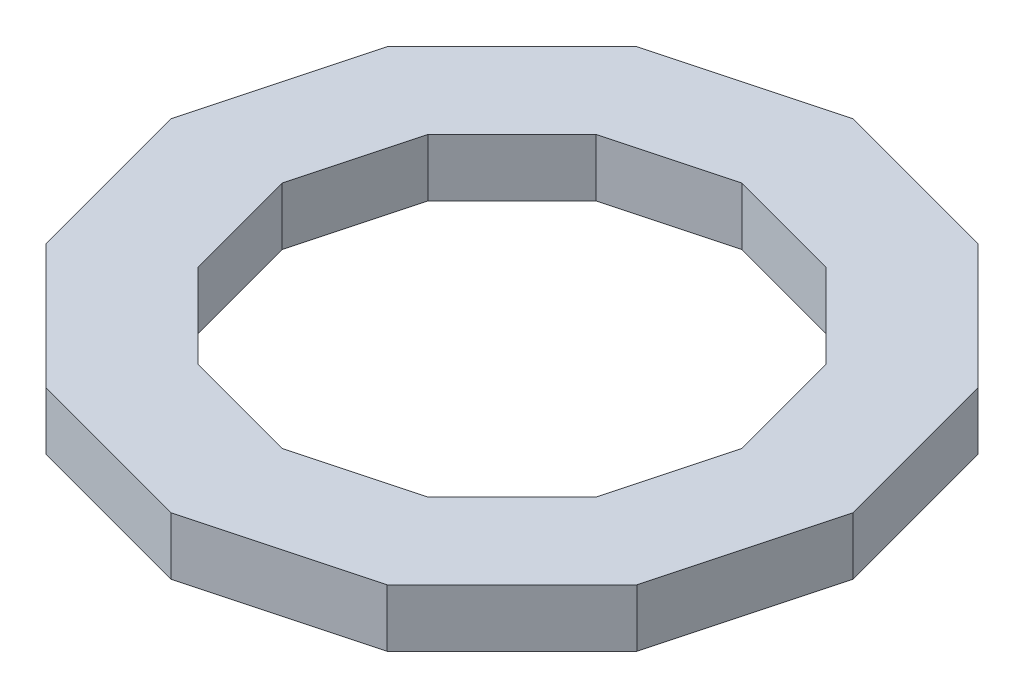
ISO-10303-21;
HEADER;
FILE_DESCRIPTION(('STEP AP214'),'2;1');
FILE_NAME('part.step','',(''),(''),'','','');
FILE_SCHEMA(('AUTOMOTIVE_DESIGN { 1 0 10303 214 1 1 1 1 }'));
ENDSEC;
DATA;
#1=APPLICATION_CONTEXT('core data for automotive mechanical design processes');
#2=APPLICATION_PROTOCOL_DEFINITION('international standard','automotive_design',2000,#1);
#3=PRODUCT_CONTEXT('',#1,'mechanical');
#4=PRODUCT('Part','Part','',(#3));
#5=PRODUCT_RELATED_PRODUCT_CATEGORY('part','',(#4));
#6=PRODUCT_DEFINITION_FORMATION('','',#4);
#7=PRODUCT_DEFINITION_CONTEXT('part definition',#1,'design');
#8=PRODUCT_DEFINITION('design','',#6,#7);
#9=PRODUCT_DEFINITION_SHAPE('','',#8);
#10=(LENGTH_UNIT() NAMED_UNIT(*) SI_UNIT(.MILLI.,.METRE.));
#11=(NAMED_UNIT(*) PLANE_ANGLE_UNIT() SI_UNIT($,.RADIAN.));
#12=(NAMED_UNIT(*) SI_UNIT($,.STERADIAN.) SOLID_ANGLE_UNIT());
#13=UNCERTAINTY_MEASURE_WITH_UNIT(LENGTH_MEASURE(1.E-05),#10,'distance_accuracy_value','');
#14=(GEOMETRIC_REPRESENTATION_CONTEXT(3) GLOBAL_UNCERTAINTY_ASSIGNED_CONTEXT((#13)) GLOBAL_UNIT_ASSIGNED_CONTEXT((#10,
#11,#12)) REPRESENTATION_CONTEXT('',''));
#15=CARTESIAN_POINT('',(0.,0.,0.));
#16=DIRECTION('',(0.,0.,1.));
#17=DIRECTION('',(1.,0.,0.));
#18=AXIS2_PLACEMENT_3D('',#15,#16,#17);
#19=CARTESIAN_POINT('',(0.,19.05,0.));
#20=DIRECTION('',(0.,1.,0.));
#21=DIRECTION('',(0.,0.,1.));
#22=AXIS2_PLACEMENT_3D('',#19,#20,#21);
#23=PLANE('',#22);
#24=DIRECTION('',(0.258819045102521,0.,-0.965925826289068));
#25=VECTOR('',#24,1.);
#26=CARTESIAN_POINT('',(97.7385649287255,19.05,56.4293867718074));
#27=LINE('',#26,#25);
#28=CARTESIAN_POINT('',(97.7385649287255,19.05,56.4293867718074));
#29=VERTEX_POINT('',#28);
#30=CARTESIAN_POINT('',(112.858773543615,19.05,0.));
#31=VERTEX_POINT('',#30);
#32=EDGE_CURVE('E292',#29,#31,#27,.T.);
#33=ORIENTED_EDGE('',*,*,#32,.T.);
#34=DIRECTION('',(-0.258819045102521,0.,-0.965925826289068));
#35=VECTOR('',#34,1.);
#36=CARTESIAN_POINT('',(112.858773543615,19.05,0.));
#37=LINE('',#36,#35);
#38=CARTESIAN_POINT('',(97.7385649287255,19.05,-56.4293867718074));
#39=VERTEX_POINT('',#38);
#40=EDGE_CURVE('E296',#31,#39,#37,.T.);
#41=ORIENTED_EDGE('',*,*,#40,.T.);
#42=DIRECTION('',(-0.707106781186548,0.,-0.707106781186547));
#43=VECTOR('',#42,1.);
#44=CARTESIAN_POINT('',(97.7385649287255,19.05,-56.4293867718074));
#45=LINE('',#44,#43);
#46=CARTESIAN_POINT('',(56.4293867718072,19.05,-97.7385649287256));
#47=VERTEX_POINT('',#46);
#48=EDGE_CURVE('E299',#39,#47,#45,.T.);
#49=ORIENTED_EDGE('',*,*,#48,.T.);
#50=DIRECTION('',(-0.965925826289068,0.,-0.258819045102521));
#51=VECTOR('',#50,1.);
#52=CARTESIAN_POINT('',(56.4293867718072,19.05,-97.7385649287256));
#53=LINE('',#52,#51);
#54=CARTESIAN_POINT('',(0.,19.05,-112.858773543615));
#55=VERTEX_POINT('',#54);
#56=EDGE_CURVE('E301',#47,#55,#53,.T.);
#57=ORIENTED_EDGE('',*,*,#56,.T.);
#58=DIRECTION('',(-0.965925826289068,0.,0.258819045102521));
#59=VECTOR('',#58,1.);
#60=CARTESIAN_POINT('',(0.,19.05,-112.858773543615));
#61=LINE('',#60,#59);
#62=CARTESIAN_POINT('',(-56.4293867718074,19.05,-97.7385649287256));
#63=VERTEX_POINT('',#62);
#64=EDGE_CURVE('E303',#55,#63,#61,.T.);
#65=ORIENTED_EDGE('',*,*,#64,.T.);
#66=DIRECTION('',(-0.707106781186547,0.,0.707106781186547));
#67=VECTOR('',#66,1.);
#68=CARTESIAN_POINT('',(-56.4293867718074,19.05,-97.7385649287256));
#69=LINE('',#68,#67);
#70=CARTESIAN_POINT('',(-97.7385649287256,19.05,-56.4293867718075));
#71=VERTEX_POINT('',#70);
#72=EDGE_CURVE('E305',#63,#71,#69,.T.);
#73=ORIENTED_EDGE('',*,*,#72,.T.);
#74=DIRECTION('',(-0.258819045102521,0.,0.965925826289068));
#75=VECTOR('',#74,1.);
#76=CARTESIAN_POINT('',(-97.7385649287256,19.05,-56.4293867718075));
#77=LINE('',#76,#75);
#78=CARTESIAN_POINT('',(-112.858773543615,19.05,0.));
#79=VERTEX_POINT('',#78);
#80=EDGE_CURVE('E307',#71,#79,#77,.T.);
#81=ORIENTED_EDGE('',*,*,#80,.T.);
#82=DIRECTION('',(0.258819045102521,0.,0.965925826289068));
#83=VECTOR('',#82,1.);
#84=CARTESIAN_POINT('',(-112.858773543615,19.05,0.));
#85=LINE('',#84,#83);
#86=CARTESIAN_POINT('',(-97.7385649287256,19.05,56.4293867718074));
#87=VERTEX_POINT('',#86);
#88=EDGE_CURVE('E310',#79,#87,#85,.T.);
#89=ORIENTED_EDGE('',*,*,#88,.T.);
#90=DIRECTION('',(0.707106781186548,0.,0.707106781186548));
#91=VECTOR('',#90,1.);
#92=CARTESIAN_POINT('',(-97.7385649287256,19.05,56.4293867718074));
#93=LINE('',#92,#91);
#94=CARTESIAN_POINT('',(-56.4293867718074,19.05,97.7385649287255));
#95=VERTEX_POINT('',#94);
#96=EDGE_CURVE('E312',#87,#95,#93,.T.);
#97=ORIENTED_EDGE('',*,*,#96,.T.);
#98=DIRECTION('',(0.965925826289068,0.,0.258819045102521));
#99=VECTOR('',#98,1.);
#100=CARTESIAN_POINT('',(-56.4293867718074,19.05,97.7385649287255));
#101=LINE('',#100,#99);
#102=CARTESIAN_POINT('',(0.,19.05,112.858773543615));
#103=VERTEX_POINT('',#102);
#104=EDGE_CURVE('E314',#95,#103,#101,.T.);
#105=ORIENTED_EDGE('',*,*,#104,.T.);
#106=DIRECTION('',(0.965925826289068,0.,-0.258819045102521));
#107=VECTOR('',#106,1.);
#108=CARTESIAN_POINT('',(0.,19.05,112.858773543615));
#109=LINE('',#108,#107);
#110=CARTESIAN_POINT('',(56.4293867718074,19.05,97.7385649287255));
#111=VERTEX_POINT('',#110);
#112=EDGE_CURVE('E316',#103,#111,#109,.T.);
#113=ORIENTED_EDGE('',*,*,#112,.T.);
#114=DIRECTION('',(0.707106781186548,0.,-0.707106781186548));
#115=VECTOR('',#114,1.);
#116=CARTESIAN_POINT('',(56.4293867718074,19.05,97.7385649287255));
#117=LINE('',#116,#115);
#118=EDGE_CURVE('E318',#111,#29,#117,.T.);
#119=ORIENTED_EDGE('',*,*,#118,.T.);
#120=EDGE_LOOP('',(#33,#41,#49,#57,#65,#73,#81,#89,#97,#105,#113,#119));
#121=FACE_BOUND('',#120,.T.);
#122=DIRECTION('',(-0.258819045102521,0.,-0.965925826289068));
#123=VECTOR('',#122,1.);
#124=CARTESIAN_POINT('',(76.0443525682322,19.05,0.));
#125=LINE('',#124,#123);
#126=CARTESIAN_POINT('',(76.0443525682322,19.05,0.));
#127=VERTEX_POINT('',#126);
#128=CARTESIAN_POINT('',(65.8563411384295,19.05,-38.0221762841161));
#129=VERTEX_POINT('',#128);
#130=EDGE_CURVE('E204',#127,#129,#125,.T.);
#131=ORIENTED_EDGE('',*,*,#130,.F.);
#132=DIRECTION('',(0.25881904510252,0.,-0.965925826289068));
#133=VECTOR('',#132,1.);
#134=CARTESIAN_POINT('',(65.8563411384295,19.05,38.0221762841161));
#135=LINE('',#134,#133);
#136=CARTESIAN_POINT('',(65.8563411384295,19.05,38.0221762841161));
#137=VERTEX_POINT('',#136);
#138=EDGE_CURVE('E196',#137,#127,#135,.T.);
#139=ORIENTED_EDGE('',*,*,#138,.F.);
#140=DIRECTION('',(0.707106781186547,0.,-0.707106781186548));
#141=VECTOR('',#140,1.);
#142=CARTESIAN_POINT('',(38.0221762841161,19.05,65.8563411384295));
#143=LINE('',#142,#141);
#144=CARTESIAN_POINT('',(38.0221762841161,19.05,65.8563411384295));
#145=VERTEX_POINT('',#144);
#146=EDGE_CURVE('E239',#145,#137,#143,.T.);
#147=ORIENTED_EDGE('',*,*,#146,.F.);
#148=DIRECTION('',(0.965925826289068,0.,-0.258819045102521));
#149=VECTOR('',#148,1.);
#150=CARTESIAN_POINT('',(0.,19.05,76.0443525682322));
#151=LINE('',#150,#149);
#152=CARTESIAN_POINT('',(0.,19.05,76.0443525682322));
#153=VERTEX_POINT('',#152);
#154=EDGE_CURVE('E236',#153,#145,#151,.T.);
#155=ORIENTED_EDGE('',*,*,#154,.F.);
#156=DIRECTION('',(0.965925826289068,0.,0.258819045102521));
#157=VECTOR('',#156,1.);
#158=CARTESIAN_POINT('',(-38.0221762841161,19.05,65.8563411384296));
#159=LINE('',#158,#157);
#160=CARTESIAN_POINT('',(-38.0221762841161,19.05,65.8563411384296));
#161=VERTEX_POINT('',#160);
#162=EDGE_CURVE('E234',#161,#153,#159,.T.);
#163=ORIENTED_EDGE('',*,*,#162,.F.);
#164=DIRECTION('',(0.707106781186548,0.,0.707106781186547));
#165=VECTOR('',#164,1.);
#166=CARTESIAN_POINT('',(-65.8563411384295,19.05,38.0221762841161));
#167=LINE('',#166,#165);
#168=CARTESIAN_POINT('',(-65.8563411384295,19.05,38.0221762841161));
#169=VERTEX_POINT('',#168);
#170=EDGE_CURVE('E231',#169,#161,#167,.T.);
#171=ORIENTED_EDGE('',*,*,#170,.F.);
#172=DIRECTION('',(0.258819045102521,0.,0.965925826289068));
#173=VECTOR('',#172,1.);
#174=CARTESIAN_POINT('',(-76.0443525682322,19.05,0.));
#175=LINE('',#174,#173);
#176=CARTESIAN_POINT('',(-76.0443525682322,19.05,0.));
#177=VERTEX_POINT('',#176);
#178=EDGE_CURVE('E229',#177,#169,#175,.T.);
#179=ORIENTED_EDGE('',*,*,#178,.F.);
#180=DIRECTION('',(-0.25881904510252,0.,0.965925826289069));
#181=VECTOR('',#180,1.);
#182=CARTESIAN_POINT('',(-65.8563411384296,19.05,-38.0221762841161));
#183=LINE('',#182,#181);
#184=CARTESIAN_POINT('',(-65.8563411384296,19.05,-38.0221762841161));
#185=VERTEX_POINT('',#184);
#186=EDGE_CURVE('E227',#185,#177,#183,.T.);
#187=ORIENTED_EDGE('',*,*,#186,.F.);
#188=DIRECTION('',(-0.707106781186547,0.,0.707106781186548));
#189=VECTOR('',#188,1.);
#190=CARTESIAN_POINT('',(-38.0221762841161,19.05,-65.8563411384296));
#191=LINE('',#190,#189);
#192=CARTESIAN_POINT('',(-38.0221762841161,19.05,-65.8563411384296));
#193=VERTEX_POINT('',#192);
#194=EDGE_CURVE('E225',#193,#185,#191,.T.);
#195=ORIENTED_EDGE('',*,*,#194,.F.);
#196=DIRECTION('',(-0.965925826289068,0.,0.258819045102521));
#197=VECTOR('',#196,1.);
#198=CARTESIAN_POINT('',(0.,19.05,-76.0443525682322));
#199=LINE('',#198,#197);
#200=CARTESIAN_POINT('',(0.,19.05,-76.0443525682322));
#201=VERTEX_POINT('',#200);
#202=EDGE_CURVE('E223',#201,#193,#199,.T.);
#203=ORIENTED_EDGE('',*,*,#202,.F.);
#204=DIRECTION('',(-0.965925826289069,0.,-0.25881904510252));
#205=VECTOR('',#204,1.);
#206=CARTESIAN_POINT('',(38.022176284116,19.05,-65.8563411384296));
#207=LINE('',#206,#205);
#208=CARTESIAN_POINT('',(38.022176284116,19.05,-65.8563411384296));
#209=VERTEX_POINT('',#208);
#210=EDGE_CURVE('E219',#209,#201,#207,.T.);
#211=ORIENTED_EDGE('',*,*,#210,.F.);
#212=DIRECTION('',(-0.707106781186548,0.,-0.707106781186547));
#213=VECTOR('',#212,1.);
#214=CARTESIAN_POINT('',(65.8563411384295,19.05,-38.0221762841161));
#215=LINE('',#214,#213);
#216=EDGE_CURVE('E217',#129,#209,#215,.T.);
#217=ORIENTED_EDGE('',*,*,#216,.F.);
#218=EDGE_LOOP('',(#131,#139,#147,#155,#163,#171,#179,#187,#195,#203,#211,#217));
#219=FACE_BOUND('',#218,.T.);
#220=ADVANCED_FACE('F35',(#121,#219),#23,.T.);
#221=CARTESIAN_POINT('',(0.,0.,0.));
#222=DIRECTION('',(0.,1.,0.));
#223=DIRECTION('',(0.,0.,1.));
#224=AXIS2_PLACEMENT_3D('',#221,#222,#223);
#225=PLANE('',#224);
#226=DIRECTION('',(0.258819045102521,0.,-0.965925826289068));
#227=VECTOR('',#226,1.);
#228=CARTESIAN_POINT('',(97.7385649287255,0.,56.4293867718074));
#229=LINE('',#228,#227);
#230=CARTESIAN_POINT('',(97.7385649287255,0.,56.4293867718074));
#231=VERTEX_POINT('',#230);
#232=CARTESIAN_POINT('',(112.858773543615,0.,0.));
#233=VERTEX_POINT('',#232);
#234=EDGE_CURVE('E212',#231,#233,#229,.T.);
#235=ORIENTED_EDGE('',*,*,#234,.F.);
#236=DIRECTION('',(0.707106781186548,0.,-0.707106781186548));
#237=VECTOR('',#236,1.);
#238=CARTESIAN_POINT('',(56.4293867718074,0.,97.7385649287255));
#239=LINE('',#238,#237);
#240=CARTESIAN_POINT('',(56.4293867718074,0.,97.7385649287255));
#241=VERTEX_POINT('',#240);
#242=EDGE_CURVE('E297',#241,#231,#239,.T.);
#243=ORIENTED_EDGE('',*,*,#242,.F.);
#244=DIRECTION('',(0.965925826289068,0.,-0.258819045102521));
#245=VECTOR('',#244,1.);
#246=CARTESIAN_POINT('',(0.,0.,112.858773543615));
#247=LINE('',#246,#245);
#248=CARTESIAN_POINT('',(0.,0.,112.858773543615));
#249=VERTEX_POINT('',#248);
#250=EDGE_CURVE('E341',#249,#241,#247,.T.);
#251=ORIENTED_EDGE('',*,*,#250,.F.);
#252=DIRECTION('',(0.965925826289068,0.,0.258819045102521));
#253=VECTOR('',#252,1.);
#254=CARTESIAN_POINT('',(-56.4293867718074,0.,97.7385649287255));
#255=LINE('',#254,#253);
#256=CARTESIAN_POINT('',(-56.4293867718074,0.,97.7385649287255));
#257=VERTEX_POINT('',#256);
#258=EDGE_CURVE('E339',#257,#249,#255,.T.);
#259=ORIENTED_EDGE('',*,*,#258,.F.);
#260=DIRECTION('',(0.707106781186548,0.,0.707106781186548));
#261=VECTOR('',#260,1.);
#262=CARTESIAN_POINT('',(-97.7385649287256,0.,56.4293867718074));
#263=LINE('',#262,#261);
#264=CARTESIAN_POINT('',(-97.7385649287256,0.,56.4293867718074));
#265=VERTEX_POINT('',#264);
#266=EDGE_CURVE('E337',#265,#257,#263,.T.);
#267=ORIENTED_EDGE('',*,*,#266,.F.);
#268=DIRECTION('',(0.258819045102521,0.,0.965925826289068));
#269=VECTOR('',#268,1.);
#270=CARTESIAN_POINT('',(-112.858773543615,0.,0.));
#271=LINE('',#270,#269);
#272=CARTESIAN_POINT('',(-112.858773543615,0.,0.));
#273=VERTEX_POINT('',#272);
#274=EDGE_CURVE('E335',#273,#265,#271,.T.);
#275=ORIENTED_EDGE('',*,*,#274,.F.);
#276=DIRECTION('',(-0.258819045102521,0.,0.965925826289068));
#277=VECTOR('',#276,1.);
#278=CARTESIAN_POINT('',(-97.7385649287256,0.,-56.4293867718075));
#279=LINE('',#278,#277);
#280=CARTESIAN_POINT('',(-97.7385649287256,0.,-56.4293867718075));
#281=VERTEX_POINT('',#280);
#282=EDGE_CURVE('E333',#281,#273,#279,.T.);
#283=ORIENTED_EDGE('',*,*,#282,.F.);
#284=DIRECTION('',(-0.707106781186547,0.,0.707106781186547));
#285=VECTOR('',#284,1.);
#286=CARTESIAN_POINT('',(-56.4293867718074,0.,-97.7385649287256));
#287=LINE('',#286,#285);
#288=CARTESIAN_POINT('',(-56.4293867718074,0.,-97.7385649287256));
#289=VERTEX_POINT('',#288);
#290=EDGE_CURVE('E331',#289,#281,#287,.T.);
#291=ORIENTED_EDGE('',*,*,#290,.F.);
#292=DIRECTION('',(-0.965925826289068,0.,0.258819045102521));
#293=VECTOR('',#292,1.);
#294=CARTESIAN_POINT('',(0.,0.,-112.858773543615));
#295=LINE('',#294,#293);
#296=CARTESIAN_POINT('',(0.,0.,-112.858773543615));
#297=VERTEX_POINT('',#296);
#298=EDGE_CURVE('E329',#297,#289,#295,.T.);
#299=ORIENTED_EDGE('',*,*,#298,.F.);
#300=DIRECTION('',(-0.965925826289068,0.,-0.258819045102521));
#301=VECTOR('',#300,1.);
#302=CARTESIAN_POINT('',(56.4293867718072,0.,-97.7385649287256));
#303=LINE('',#302,#301);
#304=CARTESIAN_POINT('',(56.4293867718072,0.,-97.7385649287256));
#305=VERTEX_POINT('',#304);
#306=EDGE_CURVE('E327',#305,#297,#303,.T.);
#307=ORIENTED_EDGE('',*,*,#306,.F.);
#308=DIRECTION('',(-0.707106781186548,0.,-0.707106781186547));
#309=VECTOR('',#308,1.);
#310=CARTESIAN_POINT('',(97.7385649287255,0.,-56.4293867718074));
#311=LINE('',#310,#309);
#312=CARTESIAN_POINT('',(97.7385649287255,0.,-56.4293867718074));
#313=VERTEX_POINT('',#312);
#314=EDGE_CURVE('E325',#313,#305,#311,.T.);
#315=ORIENTED_EDGE('',*,*,#314,.F.);
#316=DIRECTION('',(-0.258819045102521,0.,-0.965925826289068));
#317=VECTOR('',#316,1.);
#318=CARTESIAN_POINT('',(112.858773543615,0.,0.));
#319=LINE('',#318,#317);
#320=EDGE_CURVE('E323',#233,#313,#319,.T.);
#321=ORIENTED_EDGE('',*,*,#320,.F.);
#322=EDGE_LOOP('',(#235,#243,#251,#259,#267,#275,#283,#291,#299,#307,#315,#321));
#323=FACE_BOUND('',#322,.T.);
#324=DIRECTION('',(0.25881904510252,0.,-0.965925826289068));
#325=VECTOR('',#324,1.);
#326=CARTESIAN_POINT('',(65.8563411384295,0.,38.0221762841161));
#327=LINE('',#326,#325);
#328=CARTESIAN_POINT('',(65.8563411384295,0.,38.0221762841161));
#329=VERTEX_POINT('',#328);
#330=CARTESIAN_POINT('',(76.0443525682322,0.,0.));
#331=VERTEX_POINT('',#330);
#332=EDGE_CURVE('E58',#329,#331,#327,.T.);
#333=ORIENTED_EDGE('',*,*,#332,.T.);
#334=DIRECTION('',(-0.258819045102521,0.,-0.965925826289068));
#335=VECTOR('',#334,1.);
#336=CARTESIAN_POINT('',(76.0443525682322,0.,0.));
#337=LINE('',#336,#335);
#338=CARTESIAN_POINT('',(65.8563411384295,0.,-38.0221762841161));
#339=VERTEX_POINT('',#338);
#340=EDGE_CURVE('E211',#331,#339,#337,.T.);
#341=ORIENTED_EDGE('',*,*,#340,.T.);
#342=DIRECTION('',(-0.707106781186548,0.,-0.707106781186547));
#343=VECTOR('',#342,1.);
#344=CARTESIAN_POINT('',(65.8563411384295,0.,-38.0221762841161));
#345=LINE('',#344,#343);
#346=CARTESIAN_POINT('',(38.022176284116,0.,-65.8563411384296));
#347=VERTEX_POINT('',#346);
#348=EDGE_CURVE('E243',#339,#347,#345,.T.);
#349=ORIENTED_EDGE('',*,*,#348,.T.);
#350=DIRECTION('',(-0.965925826289069,0.,-0.25881904510252));
#351=VECTOR('',#350,1.);
#352=CARTESIAN_POINT('',(38.022176284116,0.,-65.8563411384296));
#353=LINE('',#352,#351);
#354=CARTESIAN_POINT('',(0.,0.,-76.0443525682322));
#355=VERTEX_POINT('',#354);
#356=EDGE_CURVE('E246',#347,#355,#353,.T.);
#357=ORIENTED_EDGE('',*,*,#356,.T.);
#358=DIRECTION('',(-0.965925826289068,0.,0.258819045102521));
#359=VECTOR('',#358,1.);
#360=CARTESIAN_POINT('',(0.,0.,-76.0443525682322));
#361=LINE('',#360,#359);
#362=CARTESIAN_POINT('',(-38.0221762841161,0.,-65.8563411384296));
#363=VERTEX_POINT('',#362);
#364=EDGE_CURVE('E249',#355,#363,#361,.T.);
#365=ORIENTED_EDGE('',*,*,#364,.T.);
#366=DIRECTION('',(-0.707106781186547,0.,0.707106781186548));
#367=VECTOR('',#366,1.);
#368=CARTESIAN_POINT('',(-38.0221762841161,0.,-65.8563411384296));
#369=LINE('',#368,#367);
#370=CARTESIAN_POINT('',(-65.8563411384296,0.,-38.0221762841161));
#371=VERTEX_POINT('',#370);
#372=EDGE_CURVE('E252',#363,#371,#369,.T.);
#373=ORIENTED_EDGE('',*,*,#372,.T.);
#374=DIRECTION('',(-0.25881904510252,0.,0.965925826289069));
#375=VECTOR('',#374,1.);
#376=CARTESIAN_POINT('',(-65.8563411384296,0.,-38.0221762841161));
#377=LINE('',#376,#375);
#378=CARTESIAN_POINT('',(-76.0443525682322,0.,0.));
#379=VERTEX_POINT('',#378);
#380=EDGE_CURVE('E255',#371,#379,#377,.T.);
#381=ORIENTED_EDGE('',*,*,#380,.T.);
#382=DIRECTION('',(0.258819045102521,0.,0.965925826289068));
#383=VECTOR('',#382,1.);
#384=CARTESIAN_POINT('',(-76.0443525682322,0.,0.));
#385=LINE('',#384,#383);
#386=CARTESIAN_POINT('',(-65.8563411384295,0.,38.0221762841161));
#387=VERTEX_POINT('',#386);
#388=EDGE_CURVE('E259',#379,#387,#385,.T.);
#389=ORIENTED_EDGE('',*,*,#388,.T.);
#390=DIRECTION('',(0.707106781186548,0.,0.707106781186547));
#391=VECTOR('',#390,1.);
#392=CARTESIAN_POINT('',(-65.8563411384295,0.,38.0221762841161));
#393=LINE('',#392,#391);
#394=CARTESIAN_POINT('',(-38.0221762841161,0.,65.8563411384296));
#395=VERTEX_POINT('',#394);
#396=EDGE_CURVE('E262',#387,#395,#393,.T.);
#397=ORIENTED_EDGE('',*,*,#396,.T.);
#398=DIRECTION('',(0.965925826289068,0.,0.258819045102521));
#399=VECTOR('',#398,1.);
#400=CARTESIAN_POINT('',(-38.0221762841161,0.,65.8563411384296));
#401=LINE('',#400,#399);
#402=CARTESIAN_POINT('',(0.,0.,76.0443525682322));
#403=VERTEX_POINT('',#402);
#404=EDGE_CURVE('E265',#395,#403,#401,.T.);
#405=ORIENTED_EDGE('',*,*,#404,.T.);
#406=DIRECTION('',(0.965925826289068,0.,-0.258819045102521));
#407=VECTOR('',#406,1.);
#408=CARTESIAN_POINT('',(0.,0.,76.0443525682322));
#409=LINE('',#408,#407);
#410=CARTESIAN_POINT('',(38.0221762841161,0.,65.8563411384295));
#411=VERTEX_POINT('',#410);
#412=EDGE_CURVE('E268',#403,#411,#409,.T.);
#413=ORIENTED_EDGE('',*,*,#412,.T.);
#414=DIRECTION('',(0.707106781186547,0.,-0.707106781186548));
#415=VECTOR('',#414,1.);
#416=CARTESIAN_POINT('',(38.0221762841161,0.,65.8563411384295));
#417=LINE('',#416,#415);
#418=EDGE_CURVE('E205',#411,#329,#417,.T.);
#419=ORIENTED_EDGE('',*,*,#418,.T.);
#420=EDGE_LOOP('',(#333,#341,#349,#357,#365,#373,#381,#389,#397,#405,#413,#419));
#421=FACE_BOUND('',#420,.T.);
#422=ADVANCED_FACE('F383',(#323,#421),#225,.F.);
#423=CARTESIAN_POINT('',(97.7385649287255,19.05,56.4293867718074));
#424=DIRECTION('',(-0.965925826289068,0.,-0.258819045102521));
#425=DIRECTION('',(-0.258819045102521,0.,0.965925826289068));
#426=AXIS2_PLACEMENT_3D('',#423,#424,#425);
#427=PLANE('',#426);
#428=ORIENTED_EDGE('',*,*,#234,.T.);
#429=DIRECTION('',(0.,-1.,0.));
#430=VECTOR('',#429,1.);
#431=CARTESIAN_POINT('',(112.858773543615,19.05,0.));
#432=LINE('',#431,#430);
#433=EDGE_CURVE('E11',#31,#233,#432,.T.);
#434=ORIENTED_EDGE('',*,*,#433,.F.);
#435=ORIENTED_EDGE('',*,*,#32,.F.);
#436=DIRECTION('',(0.,-1.,0.));
#437=VECTOR('',#436,1.);
#438=CARTESIAN_POINT('',(97.7385649287255,19.05,56.4293867718074));
#439=LINE('',#438,#437);
#440=EDGE_CURVE('E320',#29,#231,#439,.T.);
#441=ORIENTED_EDGE('',*,*,#440,.T.);
#442=EDGE_LOOP('',(#428,#434,#435,#441));
#443=FACE_BOUND('',#442,.T.);
#444=ADVANCED_FACE('F37',(#443),#427,.F.);
#445=CARTESIAN_POINT('',(112.858773543615,19.05,0.));
#446=DIRECTION('',(-0.965925826289068,0.,0.258819045102521));
#447=DIRECTION('',(0.258819045102521,0.,0.965925826289068));
#448=AXIS2_PLACEMENT_3D('',#445,#446,#447);
#449=PLANE('',#448);
#450=ORIENTED_EDGE('',*,*,#320,.T.);
#451=DIRECTION('',(0.,-1.,0.));
#452=VECTOR('',#451,1.);
#453=CARTESIAN_POINT('',(97.7385649287255,19.05,-56.4293867718074));
#454=LINE('',#453,#452);
#455=EDGE_CURVE('E43',#39,#313,#454,.T.);
#456=ORIENTED_EDGE('',*,*,#455,.F.);
#457=ORIENTED_EDGE('',*,*,#40,.F.);
#458=ORIENTED_EDGE('',*,*,#433,.T.);
#459=EDGE_LOOP('',(#450,#456,#457,#458));
#460=FACE_BOUND('',#459,.T.);
#461=ADVANCED_FACE('F400',(#460),#449,.F.);
#462=CARTESIAN_POINT('',(97.7385649287255,19.05,-56.4293867718074));
#463=DIRECTION('',(-0.707106781186547,0.,0.707106781186548));
#464=DIRECTION('',(0.707106781186548,0.,0.707106781186547));
#465=AXIS2_PLACEMENT_3D('',#462,#463,#464);
#466=PLANE('',#465);
#467=ORIENTED_EDGE('',*,*,#314,.T.);
#468=DIRECTION('',(0.,-1.,0.));
#469=VECTOR('',#468,1.);
#470=CARTESIAN_POINT('',(56.4293867718072,19.05,-97.7385649287256));
#471=LINE('',#470,#469);
#472=EDGE_CURVE('E370',#47,#305,#471,.T.);
#473=ORIENTED_EDGE('',*,*,#472,.F.);
#474=ORIENTED_EDGE('',*,*,#48,.F.);
#475=ORIENTED_EDGE('',*,*,#455,.T.);
#476=EDGE_LOOP('',(#467,#473,#474,#475));
#477=FACE_BOUND('',#476,.T.);
#478=ADVANCED_FACE('F377',(#477),#466,.F.);
#479=CARTESIAN_POINT('',(56.4293867718072,19.05,-97.7385649287256));
#480=DIRECTION('',(-0.258819045102521,0.,0.965925826289068));
#481=DIRECTION('',(0.965925826289068,0.,0.258819045102521));
#482=AXIS2_PLACEMENT_3D('',#479,#480,#481);
#483=PLANE('',#482);
#484=ORIENTED_EDGE('',*,*,#306,.T.);
#485=DIRECTION('',(0.,-1.,0.));
#486=VECTOR('',#485,1.);
#487=CARTESIAN_POINT('',(0.,19.05,-112.858773543615));
#488=LINE('',#487,#486);
#489=EDGE_CURVE('E367',#55,#297,#488,.T.);
#490=ORIENTED_EDGE('',*,*,#489,.F.);
#491=ORIENTED_EDGE('',*,*,#56,.F.);
#492=ORIENTED_EDGE('',*,*,#472,.T.);
#493=EDGE_LOOP('',(#484,#490,#491,#492));
#494=FACE_BOUND('',#493,.T.);
#495=ADVANCED_FACE('F389',(#494),#483,.F.);
#496=CARTESIAN_POINT('',(0.,19.05,-112.858773543615));
#497=DIRECTION('',(0.258819045102521,0.,0.965925826289068));
#498=DIRECTION('',(0.965925826289068,0.,-0.258819045102521));
#499=AXIS2_PLACEMENT_3D('',#496,#497,#498);
#500=PLANE('',#499);
#501=ORIENTED_EDGE('',*,*,#298,.T.);
#502=DIRECTION('',(0.,-1.,0.));
#503=VECTOR('',#502,1.);
#504=CARTESIAN_POINT('',(-56.4293867718074,19.05,-97.7385649287256));
#505=LINE('',#504,#503);
#506=EDGE_CURVE('E364',#63,#289,#505,.T.);
#507=ORIENTED_EDGE('',*,*,#506,.F.);
#508=ORIENTED_EDGE('',*,*,#64,.F.);
#509=ORIENTED_EDGE('',*,*,#489,.T.);
#510=EDGE_LOOP('',(#501,#507,#508,#509));
#511=FACE_BOUND('',#510,.T.);
#512=ADVANCED_FACE('F393',(#511),#500,.F.);
#513=CARTESIAN_POINT('',(-56.4293867718074,19.05,-97.7385649287256));
#514=DIRECTION('',(0.707106781186548,0.,0.707106781186547));
#515=DIRECTION('',(0.707106781186547,0.,-0.707106781186548));
#516=AXIS2_PLACEMENT_3D('',#513,#514,#515);
#517=PLANE('',#516);
#518=ORIENTED_EDGE('',*,*,#290,.T.);
#519=DIRECTION('',(0.,-1.,0.));
#520=VECTOR('',#519,1.);
#521=CARTESIAN_POINT('',(-97.7385649287256,19.05,-56.4293867718075));
#522=LINE('',#521,#520);
#523=EDGE_CURVE('E361',#71,#281,#522,.T.);
#524=ORIENTED_EDGE('',*,*,#523,.F.);
#525=ORIENTED_EDGE('',*,*,#72,.F.);
#526=ORIENTED_EDGE('',*,*,#506,.T.);
#527=EDGE_LOOP('',(#518,#524,#525,#526));
#528=FACE_BOUND('',#527,.T.);
#529=ADVANCED_FACE('F433',(#528),#517,.F.);
#530=CARTESIAN_POINT('',(-97.7385649287256,19.05,-56.4293867718075));
#531=DIRECTION('',(0.965925826289068,0.,0.258819045102521));
#532=DIRECTION('',(0.258819045102521,0.,-0.965925826289068));
#533=AXIS2_PLACEMENT_3D('',#530,#531,#532);
#534=PLANE('',#533);
#535=ORIENTED_EDGE('',*,*,#282,.T.);
#536=DIRECTION('',(0.,-1.,0.));
#537=VECTOR('',#536,1.);
#538=CARTESIAN_POINT('',(-112.858773543615,19.05,0.));
#539=LINE('',#538,#537);
#540=EDGE_CURVE('E358',#79,#273,#539,.T.);
#541=ORIENTED_EDGE('',*,*,#540,.F.);
#542=ORIENTED_EDGE('',*,*,#80,.F.);
#543=ORIENTED_EDGE('',*,*,#523,.T.);
#544=EDGE_LOOP('',(#535,#541,#542,#543));
#545=FACE_BOUND('',#544,.T.);
#546=ADVANCED_FACE('F431',(#545),#534,.F.);
#547=CARTESIAN_POINT('',(-112.858773543615,19.05,0.));
#548=DIRECTION('',(0.965925826289068,0.,-0.258819045102521));
#549=DIRECTION('',(-0.258819045102521,0.,-0.965925826289068));
#550=AXIS2_PLACEMENT_3D('',#547,#548,#549);
#551=PLANE('',#550);
#552=ORIENTED_EDGE('',*,*,#274,.T.);
#553=DIRECTION('',(0.,-1.,0.));
#554=VECTOR('',#553,1.);
#555=CARTESIAN_POINT('',(-97.7385649287256,19.05,56.4293867718074));
#556=LINE('',#555,#554);
#557=EDGE_CURVE('E355',#87,#265,#556,.T.);
#558=ORIENTED_EDGE('',*,*,#557,.F.);
#559=ORIENTED_EDGE('',*,*,#88,.F.);
#560=ORIENTED_EDGE('',*,*,#540,.T.);
#561=EDGE_LOOP('',(#552,#558,#559,#560));
#562=FACE_BOUND('',#561,.T.);
#563=ADVANCED_FACE('F427',(#562),#551,.F.);
#564=CARTESIAN_POINT('',(-97.7385649287256,19.05,56.4293867718074));
#565=DIRECTION('',(0.707106781186548,0.,-0.707106781186548));
#566=DIRECTION('',(-0.707106781186548,0.,-0.707106781186548));
#567=AXIS2_PLACEMENT_3D('',#564,#565,#566);
#568=PLANE('',#567);
#569=ORIENTED_EDGE('',*,*,#266,.T.);
#570=DIRECTION('',(0.,-1.,0.));
#571=VECTOR('',#570,1.);
#572=CARTESIAN_POINT('',(-56.4293867718074,19.05,97.7385649287255));
#573=LINE('',#572,#571);
#574=EDGE_CURVE('E352',#95,#257,#573,.T.);
#575=ORIENTED_EDGE('',*,*,#574,.F.);
#576=ORIENTED_EDGE('',*,*,#96,.F.);
#577=ORIENTED_EDGE('',*,*,#557,.T.);
#578=EDGE_LOOP('',(#569,#575,#576,#577));
#579=FACE_BOUND('',#578,.T.);
#580=ADVANCED_FACE('F422',(#579),#568,.F.);
#581=CARTESIAN_POINT('',(-56.4293867718074,19.05,97.7385649287255));
#582=DIRECTION('',(0.258819045102521,0.,-0.965925826289068));
#583=DIRECTION('',(-0.965925826289068,0.,-0.258819045102521));
#584=AXIS2_PLACEMENT_3D('',#581,#582,#583);
#585=PLANE('',#584);
#586=ORIENTED_EDGE('',*,*,#258,.T.);
#587=DIRECTION('',(0.,-1.,0.));
#588=VECTOR('',#587,1.);
#589=CARTESIAN_POINT('',(0.,19.05,112.858773543615));
#590=LINE('',#589,#588);
#591=EDGE_CURVE('E349',#103,#249,#590,.T.);
#592=ORIENTED_EDGE('',*,*,#591,.F.);
#593=ORIENTED_EDGE('',*,*,#104,.F.);
#594=ORIENTED_EDGE('',*,*,#574,.T.);
#595=EDGE_LOOP('',(#586,#592,#593,#594));
#596=FACE_BOUND('',#595,.T.);
#597=ADVANCED_FACE('F416',(#596),#585,.F.);
#598=CARTESIAN_POINT('',(0.,19.05,112.858773543615));
#599=DIRECTION('',(-0.258819045102521,0.,-0.965925826289068));
#600=DIRECTION('',(-0.965925826289068,0.,0.258819045102521));
#601=AXIS2_PLACEMENT_3D('',#598,#599,#600);
#602=PLANE('',#601);
#603=ORIENTED_EDGE('',*,*,#250,.T.);
#604=DIRECTION('',(0.,-1.,0.));
#605=VECTOR('',#604,1.);
#606=CARTESIAN_POINT('',(56.4293867718074,19.05,97.7385649287255));
#607=LINE('',#606,#605);
#608=EDGE_CURVE('E346',#111,#241,#607,.T.);
#609=ORIENTED_EDGE('',*,*,#608,.F.);
#610=ORIENTED_EDGE('',*,*,#112,.F.);
#611=ORIENTED_EDGE('',*,*,#591,.T.);
#612=EDGE_LOOP('',(#603,#609,#610,#611));
#613=FACE_BOUND('',#612,.T.);
#614=ADVANCED_FACE('F412',(#613),#602,.F.);
#615=CARTESIAN_POINT('',(56.4293867718074,19.05,97.7385649287255));
#616=DIRECTION('',(-0.707106781186548,0.,-0.707106781186548));
#617=DIRECTION('',(-0.707106781186548,0.,0.707106781186548));
#618=AXIS2_PLACEMENT_3D('',#615,#616,#617);
#619=PLANE('',#618);
#620=ORIENTED_EDGE('',*,*,#242,.T.);
#621=ORIENTED_EDGE('',*,*,#440,.F.);
#622=ORIENTED_EDGE('',*,*,#118,.F.);
#623=ORIENTED_EDGE('',*,*,#608,.T.);
#624=EDGE_LOOP('',(#620,#621,#622,#623));
#625=FACE_BOUND('',#624,.T.);
#626=ADVANCED_FACE('F407',(#625),#619,.F.);
#627=CARTESIAN_POINT('',(65.8563411384295,19.05,38.0221762841161));
#628=DIRECTION('',(-0.965925826289068,0.,-0.258819045102521));
#629=DIRECTION('',(-0.258819045102521,0.,0.965925826289068));
#630=AXIS2_PLACEMENT_3D('',#627,#628,#629);
#631=PLANE('',#630);
#632=ORIENTED_EDGE('',*,*,#332,.F.);
#633=DIRECTION('',(0.,-1.,0.));
#634=VECTOR('',#633,1.);
#635=CARTESIAN_POINT('',(65.8563411384295,19.05,38.0221762841161));
#636=LINE('',#635,#634);
#637=EDGE_CURVE('E200',#137,#329,#636,.T.);
#638=ORIENTED_EDGE('',*,*,#637,.F.);
#639=ORIENTED_EDGE('',*,*,#138,.T.);
#640=DIRECTION('',(0.,-1.,0.));
#641=VECTOR('',#640,1.);
#642=CARTESIAN_POINT('',(76.0443525682322,19.05,0.));
#643=LINE('',#642,#641);
#644=EDGE_CURVE('E199',#127,#331,#643,.T.);
#645=ORIENTED_EDGE('',*,*,#644,.T.);
#646=EDGE_LOOP('',(#632,#638,#639,#645));
#647=FACE_BOUND('',#646,.T.);
#648=ADVANCED_FACE('F198',(#647),#631,.T.);
#649=CARTESIAN_POINT('',(76.0443525682322,19.05,0.));
#650=DIRECTION('',(-0.965925826289068,0.,0.258819045102521));
#651=DIRECTION('',(0.258819045102521,0.,0.965925826289068));
#652=AXIS2_PLACEMENT_3D('',#649,#650,#651);
#653=PLANE('',#652);
#654=ORIENTED_EDGE('',*,*,#340,.F.);
#655=ORIENTED_EDGE('',*,*,#644,.F.);
#656=ORIENTED_EDGE('',*,*,#130,.T.);
#657=DIRECTION('',(0.,-1.,0.));
#658=VECTOR('',#657,1.);
#659=CARTESIAN_POINT('',(65.8563411384295,19.05,-38.0221762841161));
#660=LINE('',#659,#658);
#661=EDGE_CURVE('E213',#129,#339,#660,.T.);
#662=ORIENTED_EDGE('',*,*,#661,.T.);
#663=EDGE_LOOP('',(#654,#655,#656,#662));
#664=FACE_BOUND('',#663,.T.);
#665=ADVANCED_FACE('F208',(#664),#653,.T.);
#666=CARTESIAN_POINT('',(65.8563411384295,19.05,-38.0221762841161));
#667=DIRECTION('',(-0.707106781186547,0.,0.707106781186548));
#668=DIRECTION('',(0.707106781186548,0.,0.707106781186547));
#669=AXIS2_PLACEMENT_3D('',#666,#667,#668);
#670=PLANE('',#669);
#671=ORIENTED_EDGE('',*,*,#348,.F.);
#672=ORIENTED_EDGE('',*,*,#661,.F.);
#673=ORIENTED_EDGE('',*,*,#216,.T.);
#674=DIRECTION('',(0.,-1.,0.));
#675=VECTOR('',#674,1.);
#676=CARTESIAN_POINT('',(38.022176284116,19.05,-65.8563411384296));
#677=LINE('',#676,#675);
#678=EDGE_CURVE('E289',#209,#347,#677,.T.);
#679=ORIENTED_EDGE('',*,*,#678,.T.);
#680=EDGE_LOOP('',(#671,#672,#673,#679));
#681=FACE_BOUND('',#680,.T.);
#682=ADVANCED_FACE('F491',(#681),#670,.T.);
#683=CARTESIAN_POINT('',(38.022176284116,19.05,-65.8563411384296));
#684=DIRECTION('',(-0.25881904510252,0.,0.965925826289068));
#685=DIRECTION('',(0.965925826289069,0.,0.25881904510252));
#686=AXIS2_PLACEMENT_3D('',#683,#684,#685);
#687=PLANE('',#686);
#688=ORIENTED_EDGE('',*,*,#356,.F.);
#689=ORIENTED_EDGE('',*,*,#678,.F.);
#690=ORIENTED_EDGE('',*,*,#210,.T.);
#691=DIRECTION('',(0.,-1.,0.));
#692=VECTOR('',#691,1.);
#693=CARTESIAN_POINT('',(0.,19.05,-76.0443525682322));
#694=LINE('',#693,#692);
#695=EDGE_CURVE('E287',#201,#355,#694,.T.);
#696=ORIENTED_EDGE('',*,*,#695,.T.);
#697=EDGE_LOOP('',(#688,#689,#690,#696));
#698=FACE_BOUND('',#697,.T.);
#699=ADVANCED_FACE('F497',(#698),#687,.T.);
#700=CARTESIAN_POINT('',(0.,19.05,-76.0443525682322));
#701=DIRECTION('',(0.258819045102521,0.,0.965925826289068));
#702=DIRECTION('',(0.965925826289068,0.,-0.258819045102521));
#703=AXIS2_PLACEMENT_3D('',#700,#701,#702);
#704=PLANE('',#703);
#705=ORIENTED_EDGE('',*,*,#364,.F.);
#706=ORIENTED_EDGE('',*,*,#695,.F.);
#707=ORIENTED_EDGE('',*,*,#202,.T.);
#708=DIRECTION('',(0.,-1.,0.));
#709=VECTOR('',#708,1.);
#710=CARTESIAN_POINT('',(-38.0221762841161,19.05,-65.8563411384296));
#711=LINE('',#710,#709);
#712=EDGE_CURVE('E285',#193,#363,#711,.T.);
#713=ORIENTED_EDGE('',*,*,#712,.T.);
#714=EDGE_LOOP('',(#705,#706,#707,#713));
#715=FACE_BOUND('',#714,.T.);
#716=ADVANCED_FACE('F505',(#715),#704,.T.);
#717=CARTESIAN_POINT('',(-38.0221762841161,19.05,-65.8563411384296));
#718=DIRECTION('',(0.707106781186548,0.,0.707106781186547));
#719=DIRECTION('',(0.707106781186547,0.,-0.707106781186548));
#720=AXIS2_PLACEMENT_3D('',#717,#718,#719);
#721=PLANE('',#720);
#722=ORIENTED_EDGE('',*,*,#372,.F.);
#723=ORIENTED_EDGE('',*,*,#712,.F.);
#724=ORIENTED_EDGE('',*,*,#194,.T.);
#725=DIRECTION('',(0.,-1.,0.));
#726=VECTOR('',#725,1.);
#727=CARTESIAN_POINT('',(-65.8563411384296,19.05,-38.0221762841161));
#728=LINE('',#727,#726);
#729=EDGE_CURVE('E283',#185,#371,#728,.T.);
#730=ORIENTED_EDGE('',*,*,#729,.T.);
#731=EDGE_LOOP('',(#722,#723,#724,#730));
#732=FACE_BOUND('',#731,.T.);
#733=ADVANCED_FACE('F513',(#732),#721,.T.);
#734=CARTESIAN_POINT('',(-65.8563411384296,19.05,-38.0221762841161));
#735=DIRECTION('',(0.965925826289068,0.,0.25881904510252));
#736=DIRECTION('',(0.25881904510252,0.,-0.965925826289068));
#737=AXIS2_PLACEMENT_3D('',#734,#735,#736);
#738=PLANE('',#737);
#739=ORIENTED_EDGE('',*,*,#380,.F.);
#740=ORIENTED_EDGE('',*,*,#729,.F.);
#741=ORIENTED_EDGE('',*,*,#186,.T.);
#742=DIRECTION('',(0.,-1.,0.));
#743=VECTOR('',#742,1.);
#744=CARTESIAN_POINT('',(-76.0443525682322,19.05,0.));
#745=LINE('',#744,#743);
#746=EDGE_CURVE('E281',#177,#379,#745,.T.);
#747=ORIENTED_EDGE('',*,*,#746,.T.);
#748=EDGE_LOOP('',(#739,#740,#741,#747));
#749=FACE_BOUND('',#748,.T.);
#750=ADVANCED_FACE('F521',(#749),#738,.T.);
#751=CARTESIAN_POINT('',(-76.0443525682322,19.05,0.));
#752=DIRECTION('',(0.965925826289068,0.,-0.258819045102521));
#753=DIRECTION('',(-0.258819045102521,0.,-0.965925826289068));
#754=AXIS2_PLACEMENT_3D('',#751,#752,#753);
#755=PLANE('',#754);
#756=ORIENTED_EDGE('',*,*,#388,.F.);
#757=ORIENTED_EDGE('',*,*,#746,.F.);
#758=ORIENTED_EDGE('',*,*,#178,.T.);
#759=DIRECTION('',(0.,-1.,0.));
#760=VECTOR('',#759,1.);
#761=CARTESIAN_POINT('',(-65.8563411384295,19.05,38.0221762841161));
#762=LINE('',#761,#760);
#763=EDGE_CURVE('E279',#169,#387,#762,.T.);
#764=ORIENTED_EDGE('',*,*,#763,.T.);
#765=EDGE_LOOP('',(#756,#757,#758,#764));
#766=FACE_BOUND('',#765,.T.);
#767=ADVANCED_FACE('F529',(#766),#755,.T.);
#768=CARTESIAN_POINT('',(-65.8563411384295,19.05,38.0221762841161));
#769=DIRECTION('',(0.707106781186547,0.,-0.707106781186548));
#770=DIRECTION('',(-0.707106781186548,0.,-0.707106781186547));
#771=AXIS2_PLACEMENT_3D('',#768,#769,#770);
#772=PLANE('',#771);
#773=ORIENTED_EDGE('',*,*,#396,.F.);
#774=ORIENTED_EDGE('',*,*,#763,.F.);
#775=ORIENTED_EDGE('',*,*,#170,.T.);
#776=DIRECTION('',(0.,-1.,0.));
#777=VECTOR('',#776,1.);
#778=CARTESIAN_POINT('',(-38.0221762841161,19.05,65.8563411384296));
#779=LINE('',#778,#777);
#780=EDGE_CURVE('E277',#161,#395,#779,.T.);
#781=ORIENTED_EDGE('',*,*,#780,.T.);
#782=EDGE_LOOP('',(#773,#774,#775,#781));
#783=FACE_BOUND('',#782,.T.);
#784=ADVANCED_FACE('F537',(#783),#772,.T.);
#785=CARTESIAN_POINT('',(-38.0221762841161,19.05,65.8563411384296));
#786=DIRECTION('',(0.258819045102521,0.,-0.965925826289068));
#787=DIRECTION('',(-0.965925826289068,0.,-0.258819045102521));
#788=AXIS2_PLACEMENT_3D('',#785,#786,#787);
#789=PLANE('',#788);
#790=ORIENTED_EDGE('',*,*,#404,.F.);
#791=ORIENTED_EDGE('',*,*,#780,.F.);
#792=ORIENTED_EDGE('',*,*,#162,.T.);
#793=DIRECTION('',(0.,-1.,0.));
#794=VECTOR('',#793,1.);
#795=CARTESIAN_POINT('',(0.,19.05,76.0443525682322));
#796=LINE('',#795,#794);
#797=EDGE_CURVE('E275',#153,#403,#796,.T.);
#798=ORIENTED_EDGE('',*,*,#797,.T.);
#799=EDGE_LOOP('',(#790,#791,#792,#798));
#800=FACE_BOUND('',#799,.T.);
#801=ADVANCED_FACE('F545',(#800),#789,.T.);
#802=CARTESIAN_POINT('',(0.,19.05,76.0443525682322));
#803=DIRECTION('',(-0.258819045102521,0.,-0.965925826289068));
#804=DIRECTION('',(-0.965925826289068,0.,0.258819045102521));
#805=AXIS2_PLACEMENT_3D('',#802,#803,#804);
#806=PLANE('',#805);
#807=ORIENTED_EDGE('',*,*,#412,.F.);
#808=ORIENTED_EDGE('',*,*,#797,.F.);
#809=ORIENTED_EDGE('',*,*,#154,.T.);
#810=DIRECTION('',(0.,-1.,0.));
#811=VECTOR('',#810,1.);
#812=CARTESIAN_POINT('',(38.0221762841161,19.05,65.8563411384295));
#813=LINE('',#812,#811);
#814=EDGE_CURVE('E50',#145,#411,#813,.T.);
#815=ORIENTED_EDGE('',*,*,#814,.T.);
#816=EDGE_LOOP('',(#807,#808,#809,#815));
#817=FACE_BOUND('',#816,.T.);
#818=ADVANCED_FACE('F553',(#817),#806,.T.);
#819=CARTESIAN_POINT('',(38.0221762841161,19.05,65.8563411384295));
#820=DIRECTION('',(-0.707106781186548,0.,-0.707106781186547));
#821=DIRECTION('',(-0.707106781186547,0.,0.707106781186548));
#822=AXIS2_PLACEMENT_3D('',#819,#820,#821);
#823=PLANE('',#822);
#824=ORIENTED_EDGE('',*,*,#418,.F.);
#825=ORIENTED_EDGE('',*,*,#814,.F.);
#826=ORIENTED_EDGE('',*,*,#146,.T.);
#827=ORIENTED_EDGE('',*,*,#637,.T.);
#828=EDGE_LOOP('',(#824,#825,#826,#827));
#829=FACE_BOUND('',#828,.T.);
#830=ADVANCED_FACE('F561',(#829),#823,.T.);
#831=CLOSED_SHELL('',(#220,#422,#444,#461,#478,#495,#512,#529,#546,#563,#580,#597,#614,#626,
#648,#665,#682,#699,#716,#733,#750,#767,#784,#801,#818,#830));
#832=MANIFOLD_SOLID_BREP('B2',#831);
#833=ADVANCED_BREP_SHAPE_REPRESENTATION('',(#18,#832),#14);
#834=SHAPE_DEFINITION_REPRESENTATION(#9,#833);
ENDSEC;
END-ISO-10303-21;
